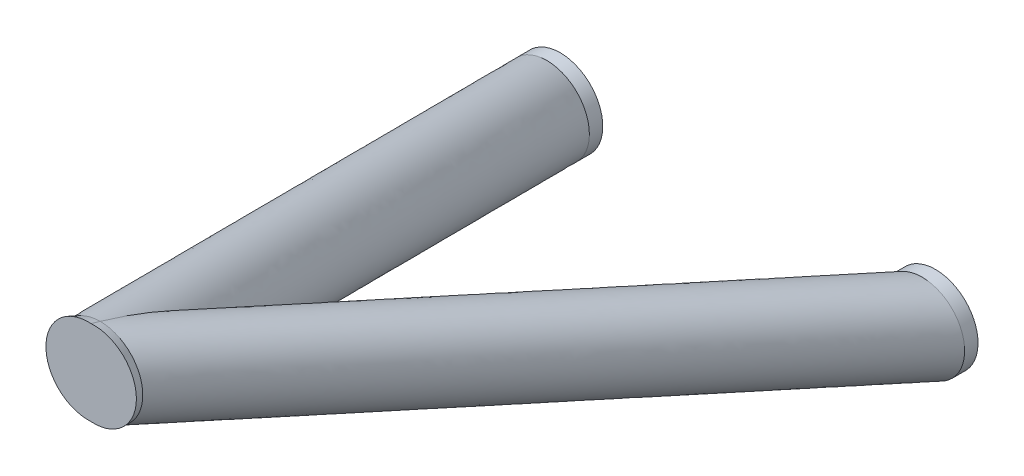
ISO-10303-21;
HEADER;
FILE_DESCRIPTION(('STEP AP214'),'2;1');
FILE_NAME('part.step','',(''),(''),'','','');
FILE_SCHEMA(('AUTOMOTIVE_DESIGN { 1 0 10303 214 1 1 1 1 }'));
ENDSEC;
DATA;
#1=APPLICATION_CONTEXT('core data for automotive mechanical design processes');
#2=APPLICATION_PROTOCOL_DEFINITION('international standard','automotive_design',2000,#1);
#3=PRODUCT_CONTEXT('',#1,'mechanical');
#4=PRODUCT('Part','Part','',(#3));
#5=PRODUCT_RELATED_PRODUCT_CATEGORY('part','',(#4));
#6=PRODUCT_DEFINITION_FORMATION('','',#4);
#7=PRODUCT_DEFINITION_CONTEXT('part definition',#1,'design');
#8=PRODUCT_DEFINITION('design','',#6,#7);
#9=PRODUCT_DEFINITION_SHAPE('','',#8);
#10=(LENGTH_UNIT() NAMED_UNIT(*) SI_UNIT(.MILLI.,.METRE.));
#11=(NAMED_UNIT(*) PLANE_ANGLE_UNIT() SI_UNIT($,.RADIAN.));
#12=(NAMED_UNIT(*) SI_UNIT($,.STERADIAN.) SOLID_ANGLE_UNIT());
#13=UNCERTAINTY_MEASURE_WITH_UNIT(LENGTH_MEASURE(1.E-05),#10,'distance_accuracy_value','');
#14=(GEOMETRIC_REPRESENTATION_CONTEXT(3) GLOBAL_UNCERTAINTY_ASSIGNED_CONTEXT((#13)) GLOBAL_UNIT_ASSIGNED_CONTEXT((#10,
#11,#12)) REPRESENTATION_CONTEXT('',''));
#15=CARTESIAN_POINT('',(0.,0.,0.));
#16=DIRECTION('',(0.,0.,1.));
#17=DIRECTION('',(1.,0.,0.));
#18=AXIS2_PLACEMENT_3D('',#15,#16,#17);
#19=CARTESIAN_POINT('',(169.75,140.,490.));
#20=CARTESIAN_POINT('',(311.75,0.,9.9999999999999));
#21=CARTESIAN_POINT('',(169.75,203.5,490.));
#22=CARTESIAN_POINT('',(311.75,63.4999999999999,9.9999999999999));
#23=CARTESIAN_POINT('',(106.25,203.5,490.));
#24=CARTESIAN_POINT('',(248.25,63.4999999999999,9.9999999999999));
#25=CARTESIAN_POINT('',(106.25,140.,490.));
#26=CARTESIAN_POINT('',(248.25,0.,9.9999999999999));
#27=CARTESIAN_POINT('',(106.25,76.5000000000001,490.));
#28=CARTESIAN_POINT('',(248.25,-63.5,9.9999999999999));
#29=CARTESIAN_POINT('',(169.75,76.5000000000001,490.));
#30=CARTESIAN_POINT('',(311.75,-63.5,9.9999999999999));
#31=CARTESIAN_POINT('',(169.75,140.,490.));
#32=CARTESIAN_POINT('',(311.75,0.,9.9999999999999));
#33=(BOUNDED_SURFACE() B_SPLINE_SURFACE(3,1,((#19,#20),(#21,#22),(#23,#24),(#25,#26),(#27,#28),
(#29,#30),(#31,#32)),.UNSPECIFIED.,.T.,.F.,.F.) B_SPLINE_SURFACE_WITH_KNOTS((4,3,4),(2,2),(0.,
0.5,1.),(0.,1.),.UNSPECIFIED.) GEOMETRIC_REPRESENTATION_ITEM() RATIONAL_B_SPLINE_SURFACE(((1.,
1.),(0.333333333333333,0.333333333333333),(0.333333333333333,0.333333333333333),(1.,1.),
(0.333333333333333,0.333333333333333),(0.333333333333333,0.333333333333333),(1.,1.))) REPRESENTATION_ITEM('') SURFACE());
#34=CARTESIAN_POINT('',(280.,0.,10.));
#35=DIRECTION('',(0.,0.,1.));
#36=DIRECTION('',(1.,0.,0.));
#37=AXIS2_PLACEMENT_3D('',#34,#35,#36);
#38=CIRCLE('',#37,31.75);
#39=CARTESIAN_POINT('',(278.,-31.6869452614164,10.));
#40=VERTEX_POINT('',#39);
#41=CARTESIAN_POINT('',(280.,-31.75,10.));
#42=VERTEX_POINT('',#41);
#43=EDGE_CURVE('E196',#40,#42,#38,.T.);
#44=CARTESIAN_POINT('',(282.,-31.6869452614164,10.));
#45=VERTEX_POINT('',#44);
#46=EDGE_CURVE('E199',#42,#45,#38,.T.);
#47=EDGE_CURVE('E58',#45,#40,#38,.T.);
#48=CARTESIAN_POINT('',(140.,169.778169014085,483.239436619718));
#49=CARTESIAN_POINT('',(139.999999999994,169.773664697485,483.223993253702));
#50=CARTESIAN_POINT('',(139.999999999987,169.769159472668,483.208550149512));
#51=CARTESIAN_POINT('',(139.999999998792,168.899840813551,480.229332476634));
#52=CARTESIAN_POINT('',(139.999999999676,168.001579113799,477.275205517756));
#53=CARTESIAN_POINT('',(140.000000000323,166.139238885457,471.387423055047));
#54=CARTESIAN_POINT('',(140.000000000086,165.175152080512,468.453770176772));
#55=CARTESIAN_POINT('',(139.999999999913,163.181043814893,462.608629462882));
#56=CARTESIAN_POINT('',(139.999999999977,162.151016045539,459.697143777944));
#57=CARTESIAN_POINT('',(140.000000000023,160.023709848152,453.89857935881));
#58=CARTESIAN_POINT('',(140.000000000004,158.926427200736,451.011502168892));
#59=CARTESIAN_POINT('',(139.999999999998,157.228127774301,446.701709531663));
#60=CARTESIAN_POINT('',(139.999999999999,156.65331673286,445.268625143534));
#61=CARTESIAN_POINT('',(140.000000000001,155.48570973895,442.409807276252));
#62=CARTESIAN_POINT('',(140.,154.892913959518,440.984073726528));
#63=CARTESIAN_POINT('',(140.,153.688809714514,438.140643607783));
#64=CARTESIAN_POINT('',(140.,153.077503493939,436.722946088693));
#65=CARTESIAN_POINT('',(140.,151.835573986713,433.896056089628));
#66=CARTESIAN_POINT('',(140.,151.204950829718,432.486863552645));
#67=CARTESIAN_POINT('',(140.,149.604665010514,428.978716215284));
#68=CARTESIAN_POINT('',(140.,148.622441273585,426.885457572787));
#69=CARTESIAN_POINT('',(140.,147.112281411376,423.763397317642));
#70=CARTESIAN_POINT('',(140.,146.602746676488,422.725660925341));
#71=CARTESIAN_POINT('',(140.,145.570793244217,420.656618336843));
#72=CARTESIAN_POINT('',(140.,145.04837469487,419.625312066932));
#73=CARTESIAN_POINT('',(140.,143.989796539916,417.569337621781));
#74=CARTESIAN_POINT('',(140.,143.453632405285,416.544671777502));
#75=CARTESIAN_POINT('',(140.,142.366941365012,414.502996928287));
#76=CARTESIAN_POINT('',(140.,141.816414658705,413.485987817336));
#77=CARTESIAN_POINT('',(140.,140.700103605696,411.460464544891));
#78=CARTESIAN_POINT('',(140.,140.134320355138,410.451949779897));
#79=CARTESIAN_POINT('',(140.,138.98637734013,408.444301703634));
#80=CARTESIAN_POINT('',(140.,138.404217854998,407.445168232743));
#81=CARTESIAN_POINT('',(140.,137.10895577145,405.266905049984));
#82=CARTESIAN_POINT('',(140.,136.392140410047,404.089976795891));
#83=CARTESIAN_POINT('',(140.,134.930710458809,401.753362252811));
#84=CARTESIAN_POINT('',(140.,134.186093782575,400.593677267043));
#85=CARTESIAN_POINT('',(140.,132.665473170282,398.294341768871));
#86=CARTESIAN_POINT('',(140.,131.889457422899,397.154699031384));
#87=CARTESIAN_POINT('',(140.,130.698744398067,395.46370651784));
#88=CARTESIAN_POINT('',(140.,130.297301754592,394.90300120314));
#89=CARTESIAN_POINT('',(140.,129.484887691912,393.788527850552));
#90=CARTESIAN_POINT('',(140.,129.073916316305,393.234759780939));
#91=CARTESIAN_POINT('',(140.,128.241819043654,392.13514481571));
#92=CARTESIAN_POINT('',(140.,127.820696051836,391.58929572379));
#93=CARTESIAN_POINT('',(140.,126.96730520813,390.506348160646));
#94=CARTESIAN_POINT('',(140.,126.535037122854,389.969249873057));
#95=CARTESIAN_POINT('',(140.,125.658624882974,388.905369273169));
#96=CARTESIAN_POINT('',(140.,125.214488160447,388.378580847088));
#97=CARTESIAN_POINT('',(140.,124.312931236491,387.336526801768));
#98=CARTESIAN_POINT('',(140.,123.855511952733,386.821260390826));
#99=CARTESIAN_POINT('',(140.,123.040111889375,385.929040987775));
#100=CARTESIAN_POINT('',(140.,122.685296262498,385.549195104297));
#101=CARTESIAN_POINT('',(140.,121.966572666587,384.798143152166));
#102=CARTESIAN_POINT('',(140.,121.602664150882,384.426937605578));
#103=CARTESIAN_POINT('',(140.,120.864885622587,383.694339220089));
#104=CARTESIAN_POINT('',(140.,120.491012935252,383.332949069646));
#105=CARTESIAN_POINT('',(140.,119.732215679018,382.621367722209));
#106=CARTESIAN_POINT('',(140.,119.347283199357,382.271184940068));
#107=CARTESIAN_POINT('',(140.,118.565735528749,381.584355940651));
#108=CARTESIAN_POINT('',(140.,118.169124597484,381.247704891132));
#109=CARTESIAN_POINT('',(140.,117.362959707934,380.590294900441));
#110=CARTESIAN_POINT('',(140.,116.953406988852,380.269534445218));
#111=CARTESIAN_POINT('',(140.,116.120397148269,379.647315433031));
#112=CARTESIAN_POINT('',(140.,115.69695301879,379.345839577131));
#113=CARTESIAN_POINT('',(140.,114.834756942095,378.766227598296));
#114=CARTESIAN_POINT('',(140.,114.396016352461,378.488074659528));
#115=CARTESIAN_POINT('',(140.,113.494718721283,377.956269101318));
#116=CARTESIAN_POINT('',(140.,113.031901972285,377.703050220583));
#117=CARTESIAN_POINT('',(140.,112.323688855041,377.351028758332));
#118=CARTESIAN_POINT('',(140.,112.085188044055,377.238283123972));
#119=CARTESIAN_POINT('',(140.,111.603507104323,377.02331371255));
#120=CARTESIAN_POINT('',(140.,111.360327628756,376.921088479229));
#121=CARTESIAN_POINT('',(140.,110.871083457895,376.729217199272));
#122=CARTESIAN_POINT('',(140.,110.625053282946,376.639483915292));
#123=CARTESIAN_POINT('',(140.,110.128592482418,376.473246233762));
#124=CARTESIAN_POINT('',(140.,109.878161456222,376.396743047518));
#125=CARTESIAN_POINT('',(140.,109.121329655637,376.189833006907));
#126=CARTESIAN_POINT('',(140.,108.608361486772,376.081608946694));
#127=CARTESIAN_POINT('',(140.,107.843241917604,375.976909753664));
#128=CARTESIAN_POINT('',(140.,107.594839603571,375.951591565202));
#129=CARTESIAN_POINT('',(140.,107.096796502732,375.919613771761));
#130=CARTESIAN_POINT('',(140.,106.847155907663,375.912951363203));
#131=CARTESIAN_POINT('',(140.,106.348239078348,375.919776401516));
#132=CARTESIAN_POINT('',(140.,106.098962729256,375.933254571137));
#133=CARTESIAN_POINT('',(140.,105.602441387886,375.981485854326));
#134=CARTESIAN_POINT('',(140.,105.355196408139,376.016239099018));
#135=CARTESIAN_POINT('',(140.,104.863310266302,376.107918169889));
#136=CARTESIAN_POINT('',(140.,104.618693288537,376.164974451239));
#137=CARTESIAN_POINT('',(140.,104.135697322914,376.301215628209));
#138=CARTESIAN_POINT('',(140.,103.897318284746,376.380400345298));
#139=CARTESIAN_POINT('',(140.,103.428708500699,376.560181631185));
#140=CARTESIAN_POINT('',(140.,103.198480158607,376.660784456216));
#141=CARTESIAN_POINT('',(140.,102.747879342846,376.882020621675));
#142=CARTESIAN_POINT('',(140.,102.527506945774,377.002654117738));
#143=CARTESIAN_POINT('',(140.,102.111927230316,377.253588978849));
#144=CARTESIAN_POINT('',(140.,101.916017908021,377.382733735869));
#145=CARTESIAN_POINT('',(140.,101.534312269836,377.655286379701));
#146=CARTESIAN_POINT('',(140.,101.348519597711,377.798699353674));
#147=CARTESIAN_POINT('',(140.,100.987350865818,378.098027866129));
#148=CARTESIAN_POINT('',(140.,100.811974097985,378.25394255306));
#149=CARTESIAN_POINT('',(140.,100.471519309208,378.576668400085));
#150=CARTESIAN_POINT('',(140.,100.30644413859,378.743482550023));
#151=CARTESIAN_POINT('',(140.,99.861998155018,379.219723595256));
#152=CARTESIAN_POINT('',(140.,99.5934346888206,379.539287443924));
#153=CARTESIAN_POINT('',(140.,99.0854964328257,380.200853448002));
#154=CARTESIAN_POINT('',(140.,98.8461425146124,380.54287138262));
#155=CARTESIAN_POINT('',(140.,98.3930533099195,381.244761371436));
#156=CARTESIAN_POINT('',(140.,98.1793940785468,381.604682178145));
#157=CARTESIAN_POINT('',(140.,97.7755465836612,382.337259460899));
#158=CARTESIAN_POINT('',(140.,97.5853543628119,382.70991377607));
#159=CARTESIAN_POINT('',(140.,97.1615892612395,383.599384461282));
#160=CARTESIAN_POINT('',(140.,96.9366643821086,384.120310503076));
#161=CARTESIAN_POINT('',(140.,96.5187683516095,385.17516930945));
#162=CARTESIAN_POINT('',(140.,96.3258255097751,385.709113122547));
#163=CARTESIAN_POINT('',(140.,95.9673086688893,386.786267365049));
#164=CARTESIAN_POINT('',(140.,95.8017453358287,387.329481315255));
#165=CARTESIAN_POINT('',(140.,95.4938829667379,388.423858820101));
#166=CARTESIAN_POINT('',(140.,95.3516427654022,388.975038775153));
#167=CARTESIAN_POINT('',(140.,95.0878991870963,390.081972254584));
#168=CARTESIAN_POINT('',(140.,94.9663841828285,390.637723029954));
#169=CARTESIAN_POINT('',(140.,94.7415053435374,391.752730820528));
#170=CARTESIAN_POINT('',(140.,94.638137538859,392.311987041134));
#171=CARTESIAN_POINT('',(140.,94.4443312426841,393.451609887366));
#172=CARTESIAN_POINT('',(140.,94.3544283485625,394.032067019997));
#173=CARTESIAN_POINT('',(140.,94.1898735999234,395.195159410518));
#174=CARTESIAN_POINT('',(140.,94.1152226952692,395.777794801764));
#175=CARTESIAN_POINT('',(140.,93.979577811495,396.945031446751));
#176=CARTESIAN_POINT('',(140.,93.9185928723535,397.529633743633));
#177=CARTESIAN_POINT('',(140.,93.8090318591229,398.700012785167));
#178=CARTESIAN_POINT('',(140.,93.7604562465951,399.285789572687));
#179=CARTESIAN_POINT('',(140.,93.6745429854316,400.459028352558));
#180=CARTESIAN_POINT('',(140.,93.6372219901723,401.046491556258));
#181=CARTESIAN_POINT('',(140.,93.5729675412499,402.221990728003));
#182=CARTESIAN_POINT('',(140.,93.5460343407743,402.81002670966));
#183=CARTESIAN_POINT('',(140.,93.4794992093407,404.576238125305));
#184=CARTESIAN_POINT('',(140.,93.4542703164119,405.754971506004));
#185=CARTESIAN_POINT('',(140.,93.4367384901626,408.113430457343));
#186=CARTESIAN_POINT('',(140.,93.4444584775656,409.293156147706));
#187=CARTESIAN_POINT('',(140.,93.4887775867119,411.651711429669));
#188=CARTESIAN_POINT('',(140.,93.5253685828059,412.830541180001));
#189=CARTESIAN_POINT('',(140.,93.6244866197673,415.194349665645));
#190=CARTESIAN_POINT('',(140.,93.6871717794986,416.379321632188));
#191=CARTESIAN_POINT('',(140.,93.8357555492065,418.746280407757));
#192=CARTESIAN_POINT('',(140.,93.9216245185742,419.928269096622));
#193=CARTESIAN_POINT('',(140.,94.1143893245346,422.289532754088));
#194=CARTESIAN_POINT('',(140.,94.22126767003,423.468809160081));
#195=CARTESIAN_POINT('',(140.,94.4542776084409,425.824877505999));
#196=CARTESIAN_POINT('',(140.,94.5803999312306,427.001670367038));
#197=CARTESIAN_POINT('',(140.,94.8504382891158,429.352970934813));
#198=CARTESIAN_POINT('',(140.,94.9943507918773,430.527479048307));
#199=CARTESIAN_POINT('',(140.,95.298761228896,432.874376450419));
#200=CARTESIAN_POINT('',(140.,95.4592597527638,434.046765662206));
#201=CARTESIAN_POINT('',(140.,95.9192784008527,437.249085654307));
#202=CARTESIAN_POINT('',(140.,96.2343678028443,439.276793098281));
#203=CARTESIAN_POINT('',(140.,96.9068562031721,443.325930863505));
#204=CARTESIAN_POINT('',(140.000000000001,97.26427137278,445.347358480769));
#205=CARTESIAN_POINT('',(139.999999999999,98.0180000477582,449.383471965333));
#206=CARTESIAN_POINT('',(139.999999999997,98.4143235095754,451.398155969868));
#207=CARTESIAN_POINT('',(140.000000000003,99.2431298324138,455.420153316165));
#208=CARTESIAN_POINT('',(140.000000000009,99.6756143473114,457.427466316415));
#209=CARTESIAN_POINT('',(139.999999999991,100.573018312992,461.427252118676));
#210=CARTESIAN_POINT('',(139.999999999965,101.03781578243,463.419752326137));
#211=CARTESIAN_POINT('',(140.000000000035,101.999522837493,467.39664726851));
#212=CARTESIAN_POINT('',(140.000000000132,102.496427317404,469.381043239071));
#213=CARTESIAN_POINT('',(139.999999999868,103.521121167051,473.341622382336));
#214=CARTESIAN_POINT('',(139.999999999508,104.048907432374,475.317806359238));
#215=CARTESIAN_POINT('',(140.000000000492,105.134459265684,479.261799333504));
#216=CARTESIAN_POINT('',(140.000000001837,105.69222288045,481.229608867524));
#217=CARTESIAN_POINT('',(140.000000000029,106.269161292042,483.208549617985));
#218=CARTESIAN_POINT('',(140.000000000014,106.273664699284,483.223993252303));
#219=CARTESIAN_POINT('',(140.,106.278169014085,483.239436619718));
#220=B_SPLINE_CURVE_WITH_KNOTS('',3,(#48,#49,#50,#51,#52,#53,#54,#55,#56,#57,#58,#59,#60,#61,
#62,#63,#64,#65,#66,#67,#68,#69,#70,#71,#72,#73,#74,#75,#76,#77,#78,#79,#80,#81,#82,#83,#84,#85,
#86,#87,#88,#89,#90,#91,#92,#93,#94,#95,#96,#97,#98,#99,#100,#101,#102,#103,#104,#105,#106,#107,
#108,#109,#110,#111,#112,#113,#114,#115,#116,#117,#118,#119,#120,#121,#122,#123,#124,#125,#126,
#127,#128,#129,#130,#131,#132,#133,#134,#135,#136,#137,#138,#139,#140,#141,#142,#143,#144,#145,
#146,#147,#148,#149,#150,#151,#152,#153,#154,#155,#156,#157,#158,#159,#160,#161,#162,#163,#164,
#165,#166,#167,#168,#169,#170,#171,#172,#173,#174,#175,#176,#177,#178,#179,#180,#181,#182,#183,
#184,#185,#186,#187,#188,#189,#190,#191,#192,#193,#194,#195,#196,#197,#198,#199,#200,#201,#202,
#203,#204,#205,#206,#207,#208,#209,#210,#211,#212,#213,#214,#215,#216,#217,#218,#219),
.UNSPECIFIED.,.F.,.F.,(4,2,2,2,2,2,2,2,2,2,2,2,2,2,2,2,2,2,2,2,2,2,2,2,2,2,2,2,2,2,2,2,2,2,2,2,
2,2,2,2,2,2,2,2,2,2,2,2,2,2,2,2,2,2,2,2,2,2,2,2,2,2,2,2,2,2,2,2,2,2,2,2,2,2,2,2,2,2,2,2,2,2,2,2,
2,4),(0.,0.0482605288673308,9.3103729316312,18.5736520352447,27.8378187002902,37.1025671694703,
41.7346637940446,46.3667158658099,50.9982083820216,55.6296698186029,62.5657313305295,
66.033903168632,69.5020351755348,72.9713249656976,76.4405666316455,79.9095597022425,
83.3784936405919,87.5122460718318,91.646309353626,95.781942464391,97.850657601309,
99.9193632744672,101.987483786216,104.05564764122,106.122545443232,108.189300784953,
109.748526848955,111.307846881306,112.867589793718,114.428477573344,115.98880290883,
117.548979289981,119.107735924918,120.665358854682,122.246519038496,123.037733886062,
123.828839063921,124.614107987714,125.399448770275,126.966817210652,127.715336267904,
128.463742832188,129.211804768081,129.959871314562,130.712380560088,131.464883734626,
132.217607017801,132.970336149779,133.673589868138,134.377095227883,135.080552709168,
135.784203973424,137.0343665582,138.285417275941,139.540084371327,140.794539597136,
142.495407940067,144.197773892146,145.900801465424,147.608061099379,149.314359749341,
151.02028468435,152.782190671635,154.544206353459,156.307384182941,158.070627583754,
159.836467383729,161.602350220756,165.138761527978,168.677633322824,172.215509469116,
175.775143019469,179.330246937647,182.882403538378,186.432854380462,189.982601390714,
193.532474633058,199.688066340719,205.84601753,212.005548637613,218.165361614274,
224.30306675155,230.439798251072,236.575913907952,242.711630240217,242.759890769084),.UNSPECIFIED.);
#221=CARTESIAN_POINT('',(140.,169.778169014085,483.239436619718));
#222=VERTEX_POINT('',#221);
#223=CARTESIAN_POINT('',(140.,106.278169014085,483.239436619718));
#224=VERTEX_POINT('',#223);
#225=EDGE_CURVE('E237',#222,#224,#220,.T.);
#226=CARTESIAN_POINT('',(140.,169.778169014085,483.239436619718));
#227=CARTESIAN_POINT('',(140.016086776566,169.778169018019,483.239436619703));
#228=CARTESIAN_POINT('',(140.032173626777,169.778156791729,483.239436619688));
#229=CARTESIAN_POINT('',(140.493701786154,169.777455154425,483.239436619294));
#230=CARTESIAN_POINT('',(140.939182755722,169.767401163336,483.239436619597));
#231=CARTESIAN_POINT('',(141.829355027732,169.728555389484,483.23943661984));
#232=CARTESIAN_POINT('',(142.274046218313,169.699761136329,483.239436619778));
#233=CARTESIAN_POINT('',(143.162090003447,169.623459405544,483.239436619662));
#234=CARTESIAN_POINT('',(143.605441694048,169.575941306457,483.239436619607));
#235=CARTESIAN_POINT('',(144.489810061587,169.462274266361,483.239436619832));
#236=CARTESIAN_POINT('',(144.930826254251,169.396121604526,483.239436620112));
#237=CARTESIAN_POINT('',(146.251192019265,169.169517431853,483.239436620417));
#238=CARTESIAN_POINT('',(147.125900992356,168.981087982037,483.239436619905));
#239=CARTESIAN_POINT('',(148.856305252434,168.53108039242,483.239436619539));
#240=CARTESIAN_POINT('',(149.712000207724,168.269500977611,483.239436619685));
#241=CARTESIAN_POINT('',(150.976115683493,167.823922465167,483.239436619735));
#242=CARTESIAN_POINT('',(151.394095826652,167.666597359303,483.239436619723));
#243=CARTESIAN_POINT('',(152.222940769247,167.334507887289,483.239436619714));
#244=CARTESIAN_POINT('',(152.633807390966,167.159748067381,483.239436619717));
#245=CARTESIAN_POINT('',(153.854909549026,166.609645687216,483.239436619722));
#246=CARTESIAN_POINT('',(154.653686222175,166.208466509377,483.239436619721));
#247=CARTESIAN_POINT('',(156.213890073522,165.340598372598,483.23943661972));
#248=CARTESIAN_POINT('',(156.975345114442,164.873959320247,483.239436619719));
#249=CARTESIAN_POINT('',(158.456272746491,163.878208293955,483.239436619718));
#250=CARTESIAN_POINT('',(159.175745887955,163.349097139226,483.239436619718));
#251=CARTESIAN_POINT('',(160.567664772003,162.232096357081,483.239436619718));
#252=CARTESIAN_POINT('',(161.240104253907,161.644198929797,483.239436619718));
#253=CARTESIAN_POINT('',(162.533087782403,160.413852750715,483.239436619719));
#254=CARTESIAN_POINT('',(163.15363138777,159.771403535206,483.23943661972));
#255=CARTESIAN_POINT('',(164.338693938231,158.43619823823,483.239436619718));
#256=CARTESIAN_POINT('',(164.903185398579,157.7434177627,483.239436619714));
#257=CARTESIAN_POINT('',(165.971772722509,156.3127707412,483.239436619722));
#258=CARTESIAN_POINT('',(166.475869932838,155.57490520115,483.239436619735));
#259=CARTESIAN_POINT('',(167.420353638542,154.058911662955,483.239436619702));
#260=CARTESIAN_POINT('',(167.860705496209,153.280762084857,483.239436619657));
#261=CARTESIAN_POINT('',(168.674274953643,151.690035743574,483.23943661978));
#262=CARTESIAN_POINT('',(169.047486452852,150.877455860236,483.239436619949));
#263=CARTESIAN_POINT('',(169.723560905623,149.224962810723,483.239436619949));
#264=CARTESIAN_POINT('',(170.026528387745,148.385092406328,483.239436619782));
#265=CARTESIAN_POINT('',(170.560585025988,146.683128440249,483.239436619656));
#266=CARTESIAN_POINT('',(170.791699869642,145.821042940161,483.239436619697));
#267=CARTESIAN_POINT('',(171.177963196852,144.092098486011,483.239436619739));
#268=CARTESIAN_POINT('',(171.33408376097,143.225456550155,483.23943661974));
#269=CARTESIAN_POINT('',(171.573822560693,141.482200582419,483.239436619726));
#270=CARTESIAN_POINT('',(171.657440688821,140.605586535757,483.239436619711));
#271=CARTESIAN_POINT('',(171.75223147053,138.836547971519,483.239436619725));
#272=CARTESIAN_POINT('',(171.762408948143,137.944069978317,483.239436619754));
#273=CARTESIAN_POINT('',(171.707607383769,136.161107642178,483.239436619682));
#274=CARTESIAN_POINT('',(171.642601431872,135.27062412744,483.23943661958));
#275=CARTESIAN_POINT('',(171.437699084371,133.496976785594,483.239436619579));
#276=CARTESIAN_POINT('',(171.297691909149,132.613825753353,483.239436619681));
#277=CARTESIAN_POINT('',(170.943730172226,130.862552922963,483.239436619755));
#278=CARTESIAN_POINT('',(170.729782324109,129.99442976784,483.239436619728));
#279=CARTESIAN_POINT('',(170.229610231355,128.279825717625,483.239436619708));
#280=CARTESIAN_POINT('',(169.943429394743,127.433332159594,483.239436619716));
#281=CARTESIAN_POINT('',(169.300756187418,125.767449110822,483.23943661972));
#282=CARTESIAN_POINT('',(168.944262283442,124.948060211585,483.239436619718));
#283=CARTESIAN_POINT('',(168.163640119784,123.342516829304,483.239436619716));
#284=CARTESIAN_POINT('',(167.73953574423,122.556350733557,483.239436619718));
#285=CARTESIAN_POINT('',(166.826619510584,121.022538184382,483.239436619719));
#286=CARTESIAN_POINT('',(166.337808038286,120.274891501333,483.239436619718));
#287=CARTESIAN_POINT('',(165.298876770569,118.823324524135,483.239436619718));
#288=CARTESIAN_POINT('',(164.748748396579,118.119410369917,483.239436619718));
#289=CARTESIAN_POINT('',(163.591147541968,116.760423913392,483.239436619718));
#290=CARTESIAN_POINT('',(162.98367483748,116.10535180178,483.239436619718));
#291=CARTESIAN_POINT('',(161.715661197718,114.8486652438,483.239436619719));
#292=CARTESIAN_POINT('',(161.055116546083,114.24705454729,483.239436619719));
#293=CARTESIAN_POINT('',(159.685699702501,113.101626060313,483.239436619718));
#294=CARTESIAN_POINT('',(158.976828039582,112.557807637371,483.239436619716));
#295=CARTESIAN_POINT('',(157.515810956073,111.531836257604,483.239436619721));
#296=CARTESIAN_POINT('',(156.763666670018,111.049681685127,483.239436619727));
#297=CARTESIAN_POINT('',(155.2213965904,110.150428545036,483.239436619709));
#298=CARTESIAN_POINT('',(154.431269127577,109.733332840014,483.239436619686));
#299=CARTESIAN_POINT('',(152.818682239961,108.967184642346,483.239436619687));
#300=CARTESIAN_POINT('',(151.996222229247,108.618133383462,483.239436619711));
#301=CARTESIAN_POINT('',(150.324918939325,107.990608755491,483.239436619724));
#302=CARTESIAN_POINT('',(149.476080292264,107.712123072675,483.239436619713));
#303=CARTESIAN_POINT('',(147.920249264114,107.273387322851,483.239436619722));
#304=CARTESIAN_POINT('',(147.216720960133,107.100742038478,483.239436619737));
#305=CARTESIAN_POINT('',(145.79945742576,106.803933902324,483.239436619699));
#306=CARTESIAN_POINT('',(145.085722010916,106.679771927831,483.239436619648));
#307=CARTESIAN_POINT('',(143.652938435999,106.480733048439,483.239436619702));
#308=CARTESIAN_POINT('',(142.933904082757,106.405756127307,483.239436619807));
#309=CARTESIAN_POINT('',(141.492600104218,106.305052769323,483.239436619629));
#310=CARTESIAN_POINT('',(140.770332120446,106.279303678557,483.239436619347));
#311=CARTESIAN_POINT('',(140.032173581084,106.278181230601,483.239436619702));
#312=CARTESIAN_POINT('',(140.016086730864,106.27816900424,483.23943661971));
#313=CARTESIAN_POINT('',(140.,106.278169014085,483.239436619718));
#314=B_SPLINE_CURVE_WITH_KNOTS('',3,(#226,#227,#228,#229,#230,#231,#232,#233,#234,#235,#236,
#237,#238,#239,#240,#241,#242,#243,#244,#245,#246,#247,#248,#249,#250,#251,#252,#253,#254,#255,
#256,#257,#258,#259,#260,#261,#262,#263,#264,#265,#266,#267,#268,#269,#270,#271,#272,#273,#274,
#275,#276,#277,#278,#279,#280,#281,#282,#283,#284,#285,#286,#287,#288,#289,#290,#291,#292,#293,
#294,#295,#296,#297,#298,#299,#300,#301,#302,#303,#304,#305,#306,#307,#308,#309,#310,#311,#312,
#313),.UNSPECIFIED.,.F.,.F.,(4,2,2,2,2,2,2,2,2,2,2,2,2,2,2,2,2,2,2,2,2,2,2,2,2,2,2,2,2,2,2,2,2,
2,2,2,2,2,2,2,2,2,2,4),(0.,0.0482605427217867,1.38457979318116,2.7210752366189,4.05832992638462,
5.3958518197139,8.07677165567141,10.7577382231262,12.0972123570497,13.436338120806,
16.1144664808818,18.7905640228422,21.4666264763654,24.1430444669799,26.8194852104534,
29.4972319120011,32.1749188905971,34.8540554425775,37.5334353054915,40.208802079409,
42.8832112989067,45.5219508918852,48.1606943964713,50.8351288505626,53.5105208437077,
56.1898754309316,58.8689868049617,61.5464919988165,64.2240555854247,66.900675381306,
69.5772792194617,72.2542580003342,74.9312472323943,77.6084240842395,80.2855716342345,
82.9626490260248,85.6398441761115,88.3170878638305,90.9938640489786,93.1654533415925,
95.3370819264864,97.5042807717979,99.6704820642969,99.7187426070167),.UNSPECIFIED.);
#315=EDGE_CURVE('E206',#224,#222,#314,.F.);
#316=ORIENTED_EDGE('',*,*,#43,.T.);
#317=ORIENTED_EDGE('',*,*,#46,.T.);
#318=ORIENTED_EDGE('',*,*,#47,.T.);
#319=EDGE_LOOP('',(#316,#317,#318));
#320=FACE_BOUND('',#319,.T.);
#321=ORIENTED_EDGE('',*,*,#225,.F.);
#322=ORIENTED_EDGE('',*,*,#315,.F.);
#323=EDGE_LOOP('',(#321,#322));
#324=FACE_BOUND('',#323,.T.);
#325=ADVANCED_FACE('F35',(#320,#324),#33,.F.);
#326=CARTESIAN_POINT('',(280.,0.,10.));
#327=DIRECTION('',(0.,0.,-1.));
#328=DIRECTION('',(-1.,0.,0.));
#329=AXIS2_PLACEMENT_3D('',#326,#327,#328);
#330=CYLINDRICAL_SURFACE('',#329,31.75);
#331=ORIENTED_EDGE('',*,*,#47,.F.);
#332=DIRECTION('',(0.,0.,-1.));
#333=VECTOR('',#332,1.);
#334=CARTESIAN_POINT('',(282.,-31.6869452614164,10.));
#335=LINE('',#334,#333);
#336=CARTESIAN_POINT('',(282.,-31.6869452614164,0.));
#337=VERTEX_POINT('',#336);
#338=EDGE_CURVE('E179',#45,#337,#335,.T.);
#339=ORIENTED_EDGE('',*,*,#338,.T.);
#340=CARTESIAN_POINT('',(280.,0.,0.));
#341=DIRECTION('',(0.,0.,1.));
#342=DIRECTION('',(1.,0.,0.));
#343=AXIS2_PLACEMENT_3D('',#340,#341,#342);
#344=CIRCLE('',#343,31.75);
#345=CARTESIAN_POINT('',(278.,-31.6869452614164,0.));
#346=VERTEX_POINT('',#345);
#347=EDGE_CURVE('E194',#337,#346,#344,.T.);
#348=ORIENTED_EDGE('',*,*,#347,.T.);
#349=DIRECTION('',(0.,0.,-1.));
#350=VECTOR('',#349,1.);
#351=CARTESIAN_POINT('',(278.,-31.6869452614164,10.));
#352=LINE('',#351,#350);
#353=EDGE_CURVE('E175',#346,#40,#352,.F.);
#354=ORIENTED_EDGE('',*,*,#353,.T.);
#355=EDGE_LOOP('',(#331,#339,#348,#354));
#356=FACE_BOUND('',#355,.T.);
#357=ADVANCED_FACE('F37',(#356),#330,.T.);
#358=CARTESIAN_POINT('',(280.,0.,0.));
#359=DIRECTION('',(0.,0.,1.));
#360=DIRECTION('',(1.,0.,0.));
#361=AXIS2_PLACEMENT_3D('',#358,#359,#360);
#362=PLANE('',#361);
#363=ORIENTED_EDGE('',*,*,#347,.F.);
#364=DIRECTION('',(0.,-1.,0.));
#365=VECTOR('',#364,1.);
#366=CARTESIAN_POINT('',(282.,-31.75,0.));
#367=LINE('',#366,#365);
#368=CARTESIAN_POINT('',(282.,-31.75,0.));
#369=VERTEX_POINT('',#368);
#370=EDGE_CURVE('E167',#337,#369,#367,.T.);
#371=ORIENTED_EDGE('',*,*,#370,.T.);
#372=DIRECTION('',(-1.,0.,0.));
#373=VECTOR('',#372,1.);
#374=CARTESIAN_POINT('',(280.,-31.75,0.));
#375=LINE('',#374,#373);
#376=CARTESIAN_POINT('',(278.,-31.75,0.));
#377=VERTEX_POINT('',#376);
#378=EDGE_CURVE('E170',#369,#377,#375,.T.);
#379=ORIENTED_EDGE('',*,*,#378,.T.);
#380=DIRECTION('',(0.,1.,0.));
#381=VECTOR('',#380,1.);
#382=CARTESIAN_POINT('',(278.,-29.75,0.));
#383=LINE('',#382,#381);
#384=EDGE_CURVE('E153',#377,#346,#383,.T.);
#385=ORIENTED_EDGE('',*,*,#384,.T.);
#386=EDGE_LOOP('',(#363,#371,#379,#385));
#387=FACE_BOUND('',#386,.T.);
#388=ADVANCED_FACE('F268',(#387),#362,.F.);
#389=CARTESIAN_POINT('',(0.,0.,0.));
#390=DIRECTION('',(0.,0.,1.));
#391=DIRECTION('',(1.,0.,0.));
#392=AXIS2_PLACEMENT_3D('',#389,#390,#391);
#393=PLANE('',#392);
#394=CARTESIAN_POINT('',(0.,0.,0.));
#395=DIRECTION('',(0.,0.,1.));
#396=DIRECTION('',(1.,0.,0.));
#397=AXIS2_PLACEMENT_3D('',#394,#395,#396);
#398=CIRCLE('',#397,31.75);
#399=CARTESIAN_POINT('',(2.,-31.6869452614164,0.));
#400=VERTEX_POINT('',#399);
#401=CARTESIAN_POINT('',(-2.,-31.6869452614164,0.));
#402=VERTEX_POINT('',#401);
#403=EDGE_CURVE('E185',#400,#402,#398,.T.);
#404=ORIENTED_EDGE('',*,*,#403,.F.);
#405=DIRECTION('',(0.,-1.,0.));
#406=VECTOR('',#405,1.);
#407=CARTESIAN_POINT('',(2.,-29.75,0.));
#408=LINE('',#407,#406);
#409=CARTESIAN_POINT('',(2.,-31.75,0.));
#410=VERTEX_POINT('',#409);
#411=EDGE_CURVE('E149',#400,#410,#408,.T.);
#412=ORIENTED_EDGE('',*,*,#411,.T.);
#413=DIRECTION('',(-1.,0.,0.));
#414=VECTOR('',#413,1.);
#415=CARTESIAN_POINT('',(2.,-31.75,0.));
#416=LINE('',#415,#414);
#417=CARTESIAN_POINT('',(-2.,-31.75,0.));
#418=VERTEX_POINT('',#417);
#419=EDGE_CURVE('E130',#410,#418,#416,.T.);
#420=ORIENTED_EDGE('',*,*,#419,.T.);
#421=DIRECTION('',(0.,1.,0.));
#422=VECTOR('',#421,1.);
#423=CARTESIAN_POINT('',(-2.,-31.75,0.));
#424=LINE('',#423,#422);
#425=EDGE_CURVE('E138',#418,#402,#424,.T.);
#426=ORIENTED_EDGE('',*,*,#425,.T.);
#427=EDGE_LOOP('',(#404,#412,#420,#426));
#428=FACE_BOUND('',#427,.T.);
#429=ADVANCED_FACE('F266',(#428),#393,.F.);
#430=CARTESIAN_POINT('',(0.,0.,10.));
#431=DIRECTION('',(0.,0.,-1.));
#432=DIRECTION('',(-1.,0.,0.));
#433=AXIS2_PLACEMENT_3D('',#430,#431,#432);
#434=CYLINDRICAL_SURFACE('',#433,31.75);
#435=CARTESIAN_POINT('',(0.,0.,10.));
#436=DIRECTION('',(0.,0.,1.));
#437=DIRECTION('',(1.,0.,0.));
#438=AXIS2_PLACEMENT_3D('',#435,#436,#437);
#439=CIRCLE('',#438,31.75);
#440=CARTESIAN_POINT('',(2.,-31.6869452614164,9.9999999999999));
#441=VERTEX_POINT('',#440);
#442=CARTESIAN_POINT('',(-2.,-31.6869452614164,9.9999999999999));
#443=VERTEX_POINT('',#442);
#444=EDGE_CURVE('E188',#441,#443,#439,.T.);
#445=ORIENTED_EDGE('',*,*,#444,.F.);
#446=DIRECTION('',(0.,0.,-1.));
#447=VECTOR('',#446,1.);
#448=CARTESIAN_POINT('',(2.,-31.6869452614164,10.));
#449=LINE('',#448,#447);
#450=EDGE_CURVE('E11',#441,#400,#449,.T.);
#451=ORIENTED_EDGE('',*,*,#450,.T.);
#452=ORIENTED_EDGE('',*,*,#403,.T.);
#453=DIRECTION('',(0.,0.,-1.));
#454=VECTOR('',#453,1.);
#455=CARTESIAN_POINT('',(-2.,-31.6869452614164,10.));
#456=LINE('',#455,#454);
#457=EDGE_CURVE('E43',#402,#443,#456,.F.);
#458=ORIENTED_EDGE('',*,*,#457,.T.);
#459=EDGE_LOOP('',(#445,#451,#452,#458));
#460=FACE_BOUND('',#459,.T.);
#461=ADVANCED_FACE('F226',(#460),#434,.T.);
#462=CARTESIAN_POINT('',(173.75,140.,490.));
#463=CARTESIAN_POINT('',(31.75,0.,9.9999999999999));
#464=CARTESIAN_POINT('',(173.75,203.5,490.));
#465=CARTESIAN_POINT('',(31.75,63.4999999999999,9.9999999999999));
#466=CARTESIAN_POINT('',(110.25,203.5,490.));
#467=CARTESIAN_POINT('',(-31.75,63.4999999999999,9.9999999999999));
#468=CARTESIAN_POINT('',(110.25,140.,490.));
#469=CARTESIAN_POINT('',(-31.75,0.,9.9999999999999));
#470=CARTESIAN_POINT('',(110.25,76.5,490.));
#471=CARTESIAN_POINT('',(-31.75,-63.5,9.9999999999999));
#472=CARTESIAN_POINT('',(173.75,76.5,490.));
#473=CARTESIAN_POINT('',(31.75,-63.5,9.9999999999999));
#474=CARTESIAN_POINT('',(173.75,140.,490.));
#475=CARTESIAN_POINT('',(31.75,0.,9.9999999999999));
#476=(BOUNDED_SURFACE() B_SPLINE_SURFACE(3,1,((#462,#463),(#464,#465),(#466,#467),(#468,#469),
(#470,#471),(#472,#473),(#474,#475)),.UNSPECIFIED.,.T.,.F.,.F.) B_SPLINE_SURFACE_WITH_KNOTS((4,
3,4),(2,2),(0.,0.5,1.),(0.,1.),
.UNSPECIFIED.) GEOMETRIC_REPRESENTATION_ITEM() RATIONAL_B_SPLINE_SURFACE(((1.,1.),
(0.333333333333333,0.333333333333333),(0.333333333333333,0.333333333333333),(1.,1.),
(0.333333333333333,0.333333333333333),(0.333333333333333,0.333333333333333),(1.,1.))) REPRESENTATION_ITEM('') SURFACE());
#477=CARTESIAN_POINT('',(0.,-31.75,10.));
#478=VERTEX_POINT('',#477);
#479=EDGE_CURVE('E144',#443,#478,#439,.T.);
#480=EDGE_CURVE('E191',#478,#441,#439,.T.);
#481=CARTESIAN_POINT('',(140.,169.778169014085,483.239436619718));
#482=CARTESIAN_POINT('',(139.983913223434,169.778169018025,483.239436619725));
#483=CARTESIAN_POINT('',(139.967826373223,169.778156791741,483.239436619731));
#484=CARTESIAN_POINT('',(139.506297500662,169.777455153515,483.239436619891));
#485=CARTESIAN_POINT('',(139.060815817698,169.76740113118,483.239436619759));
#486=CARTESIAN_POINT('',(138.170642122641,169.728555235025,483.239436619683));
#487=CARTESIAN_POINT('',(137.725950222412,169.699760890797,483.239436619739));
#488=CARTESIAN_POINT('',(136.837905026185,169.623458918176,483.239436619703));
#489=CARTESIAN_POINT('',(136.39455263414,169.575940668333,483.239436619612));
#490=CARTESIAN_POINT('',(135.51018287447,169.462273267518,483.239436619825));
#491=CARTESIAN_POINT('',(135.069165991121,169.396120395692,483.23943662013));
#492=CARTESIAN_POINT('',(133.748800983333,169.169515986606,483.239436620467));
#493=CARTESIAN_POINT('',(132.874093442369,168.981086659965,483.239436619918));
#494=CARTESIAN_POINT('',(131.143692001042,168.531079552924,483.239436619526));
#495=CARTESIAN_POINT('',(130.287998432175,168.269500498279,483.239436619683));
#496=CARTESIAN_POINT('',(129.023896040033,167.823926597464,483.239436619736));
#497=CARTESIAN_POINT('',(128.605927453102,167.66660612174,483.239436619723));
#498=CARTESIAN_POINT('',(127.777105207051,167.334526873201,483.239436619714));
#499=CARTESIAN_POINT('',(127.366249725744,167.159772646403,483.239436619717));
#500=CARTESIAN_POINT('',(126.145180511954,166.609688561199,483.239436619722));
#501=CARTESIAN_POINT('',(125.346424946497,166.208523523545,483.23943661972));
#502=CARTESIAN_POINT('',(123.786217651978,165.340663116435,483.239436619718));
#503=CARTESIAN_POINT('',(123.024740095621,164.874014008404,483.239436619718));
#504=CARTESIAN_POINT('',(121.543768568607,163.878238678551,483.239436619719));
#505=CARTESIAN_POINT('',(120.824274106689,163.349113188011,483.239436619719));
#506=CARTESIAN_POINT('',(119.432214604622,162.231999554759,483.239436619718));
#507=CARTESIAN_POINT('',(118.759662638473,161.643995123754,483.239436619717));
#508=CARTESIAN_POINT('',(117.466476417818,160.413420044855,483.23943661972));
#509=CARTESIAN_POINT('',(116.845842324024,159.770849228062,483.239436619724));
#510=CARTESIAN_POINT('',(115.660826235355,158.435618914843,483.239436619724));
#511=CARTESIAN_POINT('',(115.09645205467,157.742952483403,483.23943661972));
#512=CARTESIAN_POINT('',(114.028066259259,156.312535051173,483.239436619717));
#513=CARTESIAN_POINT('',(113.524054608063,155.574784077623,483.23943661972));
#514=CARTESIAN_POINT('',(112.580005004831,154.059487326384,483.239436619717));
#515=CARTESIAN_POINT('',(112.13996331082,153.28194387999,483.239436619712));
#516=CARTESIAN_POINT('',(111.326946911114,151.692550385139,483.239436619725));
#517=CARTESIAN_POINT('',(110.953972208892,150.880700334906,483.239436619742));
#518=CARTESIAN_POINT('',(110.277749095148,149.228484076317,483.239436619742));
#519=CARTESIAN_POINT('',(109.974499125069,148.388118505851,483.239436619724));
#520=CARTESIAN_POINT('',(109.439870664119,146.684828367188,483.239436619712));
#521=CARTESIAN_POINT('',(109.20849217201,145.82190379938,483.239436619717));
#522=CARTESIAN_POINT('',(108.819249540787,144.079621218653,483.239436619719));
#523=CARTESIAN_POINT('',(108.661386175389,143.200263032879,483.239436619716));
#524=CARTESIAN_POINT('',(108.420299706535,141.431373738734,483.23943661972));
#525=CARTESIAN_POINT('',(108.337076604053,140.54184263023,483.239436619727));
#526=CARTESIAN_POINT('',(108.245862270967,138.758930372594,483.239436619727));
#527=CARTESIAN_POINT('',(108.237871137483,137.865549218493,483.239436619721));
#528=CARTESIAN_POINT('',(108.297177807865,136.081289430496,483.239436619715));
#529=CARTESIAN_POINT('',(108.364475611185,135.190410796583,483.239436619716));
#530=CARTESIAN_POINT('',(108.573881004801,133.417495604224,483.239436619721));
#531=CARTESIAN_POINT('',(108.715988094271,132.535458986625,483.239436619725));
#532=CARTESIAN_POINT('',(109.074001474372,130.786492439488,483.239436619711));
#533=CARTESIAN_POINT('',(109.289907765636,129.919562510079,483.239436619693));
#534=CARTESIAN_POINT('',(109.793987665034,128.206962241967,483.239436619693));
#535=CARTESIAN_POINT('',(110.08216214815,127.361292160801,483.239436619712));
#536=CARTESIAN_POINT('',(110.728728324625,125.697234811221,483.239436619725));
#537=CARTESIAN_POINT('',(111.087120015435,124.878847541815,483.239436619719));
#538=CARTESIAN_POINT('',(111.8715869889,123.275144825395,483.239436619718));
#539=CARTESIAN_POINT('',(112.297664736906,122.489830584329,483.239436619723));
#540=CARTESIAN_POINT('',(113.21446505996,120.957888940039,483.239436619713));
#541=CARTESIAN_POINT('',(113.705187661186,120.21126155248,483.239436619698));
#542=CARTESIAN_POINT('',(114.747745083942,118.762063418031,483.239436619698));
#543=CARTESIAN_POINT('',(115.299574739206,118.059488954561,483.239436619713));
#544=CARTESIAN_POINT('',(116.460453460378,116.703325117725,483.239436619724));
#545=CARTESIAN_POINT('',(117.069502406657,116.049735641951,483.23943661972));
#546=CARTESIAN_POINT('',(118.340384424186,114.796295955,483.239436619717));
#547=CARTESIAN_POINT('',(119.002207842201,114.19643595833,483.239436619718));
#548=CARTESIAN_POINT('',(120.374002720197,113.054597729723,483.239436619719));
#549=CARTESIAN_POINT('',(121.083974569495,112.512619965901,483.239436619719));
#550=CARTESIAN_POINT('',(122.547482395117,111.490100729767,483.239436619717));
#551=CARTESIAN_POINT('',(123.301038113679,111.009587420637,483.239436619715));
#552=CARTESIAN_POINT('',(124.459458372612,110.337854878292,483.23943661972));
#553=CARTESIAN_POINT('',(124.850291922538,110.122111101512,483.239436619722));
#554=CARTESIAN_POINT('',(125.640808971104,109.70723275538,483.239436619715));
#555=CARTESIAN_POINT('',(126.040494727038,109.508102485607,483.239436619704));
#556=CARTESIAN_POINT('',(127.252095037095,108.936052113069,483.239436619747));
#557=CARTESIAN_POINT('',(128.076227069001,108.588661190852,483.239436619874));
#558=CARTESIAN_POINT('',(129.750857123295,107.964636540321,483.239436619558));
#559=CARTESIAN_POINT('',(130.601354950823,107.68800228921,483.239436619116));
#560=CARTESIAN_POINT('',(131.891437493647,107.327796676275,483.239436619384));
#561=CARTESIAN_POINT('',(132.323558767393,107.216908670949,483.239436619629));
#562=CARTESIAN_POINT('',(133.19201508375,107.013452622684,483.239436619808));
#563=CARTESIAN_POINT('',(133.628349123018,106.920880325178,483.239436619742));
#564=CARTESIAN_POINT('',(134.504347945184,106.754233595569,483.23943661969));
#565=CARTESIAN_POINT('',(134.944011325436,106.680151776452,483.239436619703));
#566=CARTESIAN_POINT('',(135.826057955287,106.550567441255,483.239436619734));
#567=CARTESIAN_POINT('',(136.268441157616,106.49506460321,483.239436619751));
#568=CARTESIAN_POINT('',(137.250053262235,106.392854218608,483.239436619678));
#569=CARTESIAN_POINT('',(137.789746161549,106.350571236016,483.239436619565));
#570=CARTESIAN_POINT('',(138.870231061602,106.29366819841,483.23943661987));
#571=CARTESIAN_POINT('',(139.41102195769,106.279027757377,483.239436620289));
#572=CARTESIAN_POINT('',(139.967826386306,106.278181235229,483.239436619752));
#573=CARTESIAN_POINT('',(139.983913236442,106.278169008927,483.239436619735));
#574=CARTESIAN_POINT('',(140.,106.278169014085,483.239436619718));
#575=B_SPLINE_CURVE_WITH_KNOTS('',3,(#481,#482,#483,#484,#485,#486,#487,#488,#489,#490,#491,
#492,#493,#494,#495,#496,#497,#498,#499,#500,#501,#502,#503,#504,#505,#506,#507,#508,#509,#510,
#511,#512,#513,#514,#515,#516,#517,#518,#519,#520,#521,#522,#523,#524,#525,#526,#527,#528,#529,
#530,#531,#532,#533,#534,#535,#536,#537,#538,#539,#540,#541,#542,#543,#544,#545,#546,#547,#548,
#549,#550,#551,#552,#553,#554,#555,#556,#557,#558,#559,#560,#561,#562,#563,#564,#565,#566,#567,
#568,#569,#570,#571,#572,#573,#574),.UNSPECIFIED.,.F.,.F.,(4,2,2,2,2,2,2,2,2,2,2,2,2,2,2,2,2,2,
2,2,2,2,2,2,2,2,2,2,2,2,2,2,2,2,2,2,2,2,2,2,2,2,2,2,2,2,4),(0.,0.0482605427218562,
1.38458193271451,2.72107951647749,4.05833634494825,5.39586037864536,8.07677595636285,
10.7577382376805,12.0971750657414,13.4362635313197,16.1143165999777,18.7904871860505,
21.4666264508445,24.1435080999983,26.820398035234,29.4976592591946,32.1749188655816,
34.852021800382,37.5291248738113,40.2061681001468,42.8832112803681,45.5602826347674,
48.2373540241177,50.9144288693618,53.591503695163,56.2685605990105,58.9456175258214,
61.6227068664757,64.2997961099521,66.9769828842587,69.6541707426372,72.3311324319993,
75.0080885247203,77.6845560806709,80.3610452805565,83.038756495353,84.3776937890399,
85.7169765320699,88.3966673008076,91.0763382696863,92.4143745000936,93.7520995513269,
95.0892893179754,96.4264559104948,98.0497993062775,99.6719450388652,99.720205581586),.UNSPECIFIED.);
#576=EDGE_CURVE('E198',#224,#222,#575,.F.);
#577=ORIENTED_EDGE('',*,*,#479,.T.);
#578=ORIENTED_EDGE('',*,*,#480,.T.);
#579=ORIENTED_EDGE('',*,*,#444,.T.);
#580=EDGE_LOOP('',(#577,#578,#579));
#581=FACE_BOUND('',#580,.T.);
#582=ORIENTED_EDGE('',*,*,#576,.T.);
#583=ORIENTED_EDGE('',*,*,#225,.T.);
#584=EDGE_LOOP('',(#582,#583));
#585=FACE_BOUND('',#584,.T.);
#586=ADVANCED_FACE('F258',(#581,#585),#476,.F.);
#587=CARTESIAN_POINT('',(138.,140.,490.));
#588=DIRECTION('',(0.,0.,1.));
#589=DIRECTION('',(1.,0.,0.));
#590=AXIS2_PLACEMENT_3D('',#587,#588,#589);
#591=PLANE('',#590);
#592=CARTESIAN_POINT('',(138.,140.,490.));
#593=DIRECTION('',(0.,0.,1.));
#594=DIRECTION('',(1.,0.,0.));
#595=AXIS2_PLACEMENT_3D('',#592,#593,#594);
#596=CIRCLE('',#595,31.75);
#597=CARTESIAN_POINT('',(140.,171.686945261416,490.));
#598=VERTEX_POINT('',#597);
#599=CARTESIAN_POINT('',(140.,108.313054738584,490.));
#600=VERTEX_POINT('',#599);
#601=EDGE_CURVE('E190',#598,#600,#596,.T.);
#602=ORIENTED_EDGE('',*,*,#601,.T.);
#603=CARTESIAN_POINT('',(142.,140.,490.));
#604=DIRECTION('',(0.,0.,1.));
#605=DIRECTION('',(1.,0.,0.));
#606=AXIS2_PLACEMENT_3D('',#603,#604,#605);
#607=CIRCLE('',#606,31.75);
#608=CARTESIAN_POINT('',(173.75,140.,490.));
#609=VERTEX_POINT('',#608);
#610=EDGE_CURVE('E181',#600,#609,#607,.T.);
#611=ORIENTED_EDGE('',*,*,#610,.T.);
#612=EDGE_CURVE('E182',#609,#598,#607,.T.);
#613=ORIENTED_EDGE('',*,*,#612,.T.);
#614=EDGE_LOOP('',(#602,#611,#613));
#615=FACE_BOUND('',#614,.T.);
#616=ADVANCED_FACE('F224',(#615),#591,.T.);
#617=CARTESIAN_POINT('',(140.,108.313054738584,490.));
#618=CARTESIAN_POINT('',(140.000000000548,107.966668176961,488.8838293651));
#619=CARTESIAN_POINT('',(140.000000000276,107.624998228339,487.766189035162));
#620=CARTESIAN_POINT('',(139.999999999725,106.951182383898,485.528085640226));
#621=CARTESIAN_POINT('',(139.999999999445,106.619036140895,484.407622679751));
#622=CARTESIAN_POINT('',(139.999999999985,106.287178555077,483.270323092096));
#623=CARTESIAN_POINT('',(139.999999999992,106.282673330254,483.25487998791));
#624=CARTESIAN_POINT('',(140.,106.278169014085,483.239436619718));
#625=B_SPLINE_CURVE_WITH_KNOTS('',3,(#617,#618,#619,#620,#621,#622,#623,#624),.UNSPECIFIED.,.F.,
.F.,(4,2,2,4),(0.,3.50605043905854,7.01197290314411,7.06023343201156),.UNSPECIFIED.);
#626=EDGE_CURVE('E247',#600,#224,#625,.T.);
#627=CARTESIAN_POINT('',(140.,171.686945261416,490.));
#628=CARTESIAN_POINT('',(140.000000000592,171.380709063666,488.878250461332));
#629=CARTESIAN_POINT('',(140.000000000297,171.069609903154,487.75782406106));
#630=CARTESIAN_POINT('',(139.999999999701,170.437814983056,485.519724702499));
#631=CARTESIAN_POINT('',(139.999999999399,170.117119577746,484.402051644205));
#632=CARTESIAN_POINT('',(139.999999999984,169.787176736638,483.270323622406));
#633=CARTESIAN_POINT('',(139.999999999992,169.782673329397,483.254879988091));
#634=CARTESIAN_POINT('',(140.,169.778169014085,483.239436619718));
#635=B_SPLINE_CURVE_WITH_KNOTS('',3,(#627,#628,#629,#630,#631,#632,#633,#634),.UNSPECIFIED.,.F.,
.F.,(4,2,2,4),(0.,3.48839658236981,6.97666453775087,7.02492506661845),.UNSPECIFIED.);
#636=EDGE_CURVE('E242',#222,#598,#635,.F.);
#637=ORIENTED_EDGE('',*,*,#626,.F.);
#638=ORIENTED_EDGE('',*,*,#601,.F.);
#639=ORIENTED_EDGE('',*,*,#636,.F.);
#640=ORIENTED_EDGE('',*,*,#576,.F.);
#641=EDGE_LOOP('',(#637,#638,#639,#640));
#642=FACE_BOUND('',#641,.T.);
#643=ADVANCED_FACE('F217',(#642),#33,.F.);
#644=ORIENTED_EDGE('',*,*,#610,.F.);
#645=ORIENTED_EDGE('',*,*,#626,.T.);
#646=ORIENTED_EDGE('',*,*,#315,.T.);
#647=ORIENTED_EDGE('',*,*,#636,.T.);
#648=ORIENTED_EDGE('',*,*,#612,.F.);
#649=EDGE_LOOP('',(#644,#645,#646,#647,#648));
#650=FACE_BOUND('',#649,.T.);
#651=ADVANCED_FACE('F211',(#650),#476,.F.);
#652=CARTESIAN_POINT('',(0.,0.,10.));
#653=DIRECTION('',(0.,0.,1.));
#654=DIRECTION('',(1.,0.,0.));
#655=AXIS2_PLACEMENT_3D('',#652,#653,#654);
#656=PLANE('',#655);
#657=ORIENTED_EDGE('',*,*,#43,.F.);
#658=DIRECTION('',(0.,1.,0.));
#659=VECTOR('',#658,1.);
#660=CARTESIAN_POINT('',(278.,-29.75,10.));
#661=LINE('',#660,#659);
#662=CARTESIAN_POINT('',(278.,-31.75,10.));
#663=VERTEX_POINT('',#662);
#664=EDGE_CURVE('E158',#663,#40,#661,.T.);
#665=ORIENTED_EDGE('',*,*,#664,.F.);
#666=DIRECTION('',(-1.,0.,0.));
#667=VECTOR('',#666,1.);
#668=CARTESIAN_POINT('',(278.,-31.75,10.));
#669=LINE('',#668,#667);
#670=EDGE_CURVE('E159',#42,#663,#669,.T.);
#671=ORIENTED_EDGE('',*,*,#670,.F.);
#672=EDGE_LOOP('',(#657,#665,#671));
#673=FACE_BOUND('',#672,.T.);
#674=ADVANCED_FACE('F298',(#673),#656,.T.);
#675=CARTESIAN_POINT('',(280.,-31.75,10.));
#676=DIRECTION('',(0.,-1.,0.));
#677=DIRECTION('',(0.,0.,-1.));
#678=AXIS2_PLACEMENT_3D('',#675,#676,#677);
#679=PLANE('',#678);
#680=ORIENTED_EDGE('',*,*,#378,.F.);
#681=DIRECTION('',(0.,0.,-1.));
#682=VECTOR('',#681,1.);
#683=CARTESIAN_POINT('',(282.,-31.75,10.));
#684=LINE('',#683,#682);
#685=CARTESIAN_POINT('',(282.,-31.75,10.));
#686=VERTEX_POINT('',#685);
#687=EDGE_CURVE('E172',#686,#369,#684,.T.);
#688=ORIENTED_EDGE('',*,*,#687,.F.);
#689=EDGE_CURVE('E155',#686,#42,#669,.T.);
#690=ORIENTED_EDGE('',*,*,#689,.T.);
#691=ORIENTED_EDGE('',*,*,#670,.T.);
#692=DIRECTION('',(0.,0.,-1.));
#693=VECTOR('',#692,1.);
#694=CARTESIAN_POINT('',(278.,-31.75,10.));
#695=LINE('',#694,#693);
#696=EDGE_CURVE('E164',#663,#377,#695,.T.);
#697=ORIENTED_EDGE('',*,*,#696,.T.);
#698=EDGE_LOOP('',(#680,#688,#690,#691,#697));
#699=FACE_BOUND('',#698,.T.);
#700=ADVANCED_FACE('F302',(#699),#679,.T.);
#701=CARTESIAN_POINT('',(282.,-31.75,10.));
#702=DIRECTION('',(1.,0.,0.));
#703=DIRECTION('',(0.,0.,-1.));
#704=AXIS2_PLACEMENT_3D('',#701,#702,#703);
#705=PLANE('',#704);
#706=ORIENTED_EDGE('',*,*,#338,.F.);
#707=DIRECTION('',(0.,-1.,0.));
#708=VECTOR('',#707,1.);
#709=CARTESIAN_POINT('',(282.,-31.75,10.));
#710=LINE('',#709,#708);
#711=EDGE_CURVE('E162',#45,#686,#710,.T.);
#712=ORIENTED_EDGE('',*,*,#711,.T.);
#713=ORIENTED_EDGE('',*,*,#687,.T.);
#714=ORIENTED_EDGE('',*,*,#370,.F.);
#715=EDGE_LOOP('',(#706,#712,#713,#714));
#716=FACE_BOUND('',#715,.T.);
#717=ADVANCED_FACE('F309',(#716),#705,.T.);
#718=CARTESIAN_POINT('',(278.,-29.75,10.));
#719=DIRECTION('',(-1.,0.,0.));
#720=DIRECTION('',(0.,0.,1.));
#721=AXIS2_PLACEMENT_3D('',#718,#719,#720);
#722=PLANE('',#721);
#723=ORIENTED_EDGE('',*,*,#353,.F.);
#724=ORIENTED_EDGE('',*,*,#384,.F.);
#725=ORIENTED_EDGE('',*,*,#696,.F.);
#726=ORIENTED_EDGE('',*,*,#664,.T.);
#727=EDGE_LOOP('',(#723,#724,#725,#726));
#728=FACE_BOUND('',#727,.T.);
#729=ADVANCED_FACE('F314',(#728),#722,.T.);
#730=ORIENTED_EDGE('',*,*,#46,.F.);
#731=ORIENTED_EDGE('',*,*,#689,.F.);
#732=ORIENTED_EDGE('',*,*,#711,.F.);
#733=EDGE_LOOP('',(#730,#731,#732));
#734=FACE_BOUND('',#733,.T.);
#735=ADVANCED_FACE('F305',(#734),#656,.T.);
#736=CARTESIAN_POINT('',(2.,-29.75,10.));
#737=DIRECTION('',(1.,0.,0.));
#738=DIRECTION('',(0.,0.,-1.));
#739=AXIS2_PLACEMENT_3D('',#736,#737,#738);
#740=PLANE('',#739);
#741=ORIENTED_EDGE('',*,*,#450,.F.);
#742=DIRECTION('',(0.,-1.,0.));
#743=VECTOR('',#742,1.);
#744=CARTESIAN_POINT('',(2.,-29.75,10.));
#745=LINE('',#744,#743);
#746=CARTESIAN_POINT('',(2.,-31.75,10.));
#747=VERTEX_POINT('',#746);
#748=EDGE_CURVE('E140',#441,#747,#745,.T.);
#749=ORIENTED_EDGE('',*,*,#748,.T.);
#750=DIRECTION('',(0.,0.,-1.));
#751=VECTOR('',#750,1.);
#752=CARTESIAN_POINT('',(2.,-31.75,10.));
#753=LINE('',#752,#751);
#754=EDGE_CURVE('E139',#747,#410,#753,.T.);
#755=ORIENTED_EDGE('',*,*,#754,.T.);
#756=ORIENTED_EDGE('',*,*,#411,.F.);
#757=EDGE_LOOP('',(#741,#749,#755,#756));
#758=FACE_BOUND('',#757,.T.);
#759=ADVANCED_FACE('F264',(#758),#740,.T.);
#760=CARTESIAN_POINT('',(-2.,-31.75,10.));
#761=DIRECTION('',(-1.,0.,0.));
#762=DIRECTION('',(0.,0.,1.));
#763=AXIS2_PLACEMENT_3D('',#760,#761,#762);
#764=PLANE('',#763);
#765=ORIENTED_EDGE('',*,*,#457,.F.);
#766=ORIENTED_EDGE('',*,*,#425,.F.);
#767=DIRECTION('',(0.,0.,-1.));
#768=VECTOR('',#767,1.);
#769=CARTESIAN_POINT('',(-2.,-31.75,10.));
#770=LINE('',#769,#768);
#771=CARTESIAN_POINT('',(-2.,-31.75,10.));
#772=VERTEX_POINT('',#771);
#773=EDGE_CURVE('E125',#772,#418,#770,.T.);
#774=ORIENTED_EDGE('',*,*,#773,.F.);
#775=DIRECTION('',(0.,1.,0.));
#776=VECTOR('',#775,1.);
#777=CARTESIAN_POINT('',(-2.,-31.75,10.));
#778=LINE('',#777,#776);
#779=EDGE_CURVE('E135',#772,#443,#778,.T.);
#780=ORIENTED_EDGE('',*,*,#779,.T.);
#781=EDGE_LOOP('',(#765,#766,#774,#780));
#782=FACE_BOUND('',#781,.T.);
#783=ADVANCED_FACE('F134',(#782),#764,.T.);
#784=CARTESIAN_POINT('',(2.,-31.75,10.));
#785=DIRECTION('',(0.,-1.,0.));
#786=DIRECTION('',(0.,0.,-1.));
#787=AXIS2_PLACEMENT_3D('',#784,#785,#786);
#788=PLANE('',#787);
#789=ORIENTED_EDGE('',*,*,#773,.T.);
#790=ORIENTED_EDGE('',*,*,#419,.F.);
#791=ORIENTED_EDGE('',*,*,#754,.F.);
#792=DIRECTION('',(-1.,0.,0.));
#793=VECTOR('',#792,1.);
#794=CARTESIAN_POINT('',(0.,-31.75,10.));
#795=LINE('',#794,#793);
#796=EDGE_CURVE('E50',#747,#478,#795,.T.);
#797=ORIENTED_EDGE('',*,*,#796,.T.);
#798=EDGE_CURVE('E121',#478,#772,#795,.T.);
#799=ORIENTED_EDGE('',*,*,#798,.T.);
#800=EDGE_LOOP('',(#789,#790,#791,#797,#799));
#801=FACE_BOUND('',#800,.T.);
#802=ADVANCED_FACE('F123',(#801),#788,.T.);
#803=CARTESIAN_POINT('',(0.,0.,10.));
#804=DIRECTION('',(0.,0.,-1.));
#805=DIRECTION('',(-1.,0.,0.));
#806=AXIS2_PLACEMENT_3D('',#803,#804,#805);
#807=PLANE('',#806);
#808=ORIENTED_EDGE('',*,*,#748,.F.);
#809=ORIENTED_EDGE('',*,*,#480,.F.);
#810=ORIENTED_EDGE('',*,*,#796,.F.);
#811=EDGE_LOOP('',(#808,#809,#810));
#812=FACE_BOUND('',#811,.T.);
#813=ADVANCED_FACE('F262',(#812),#807,.F.);
#814=ORIENTED_EDGE('',*,*,#798,.F.);
#815=ORIENTED_EDGE('',*,*,#479,.F.);
#816=ORIENTED_EDGE('',*,*,#779,.F.);
#817=EDGE_LOOP('',(#814,#815,#816));
#818=FACE_BOUND('',#817,.T.);
#819=ADVANCED_FACE('F142',(#818),#807,.F.);
#820=CLOSED_SHELL('',(#325,#357,#388,#429,#461,#586,#616,#643,#651,#674,#700,#717,#729,#735,
#759,#783,#802,#813,#819));
#821=MANIFOLD_SOLID_BREP('B2',#820);
#822=ADVANCED_BREP_SHAPE_REPRESENTATION('',(#18,#821),#14);
#823=SHAPE_DEFINITION_REPRESENTATION(#9,#822);
ENDSEC;
END-ISO-10303-21;
